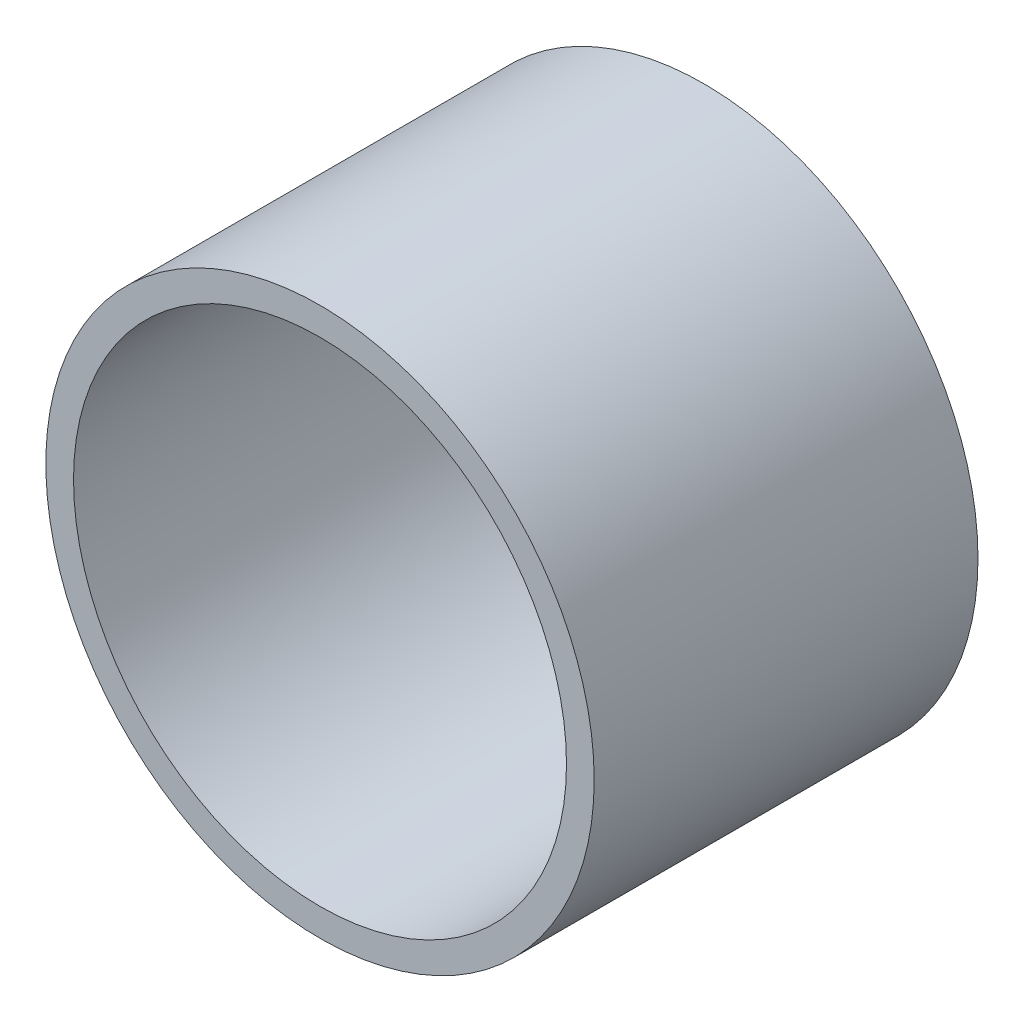
ISO-10303-21;
HEADER;
FILE_DESCRIPTION(('STEP AP214'),'2;1');
FILE_NAME('part.step','',(''),(''),'','','');
FILE_SCHEMA(('AUTOMOTIVE_DESIGN { 1 0 10303 214 1 1 1 1 }'));
ENDSEC;
DATA;
#1=APPLICATION_CONTEXT('core data for automotive mechanical design processes');
#2=APPLICATION_PROTOCOL_DEFINITION('international standard','automotive_design',2000,#1);
#3=PRODUCT_CONTEXT('',#1,'mechanical');
#4=PRODUCT('Part','Part','',(#3));
#5=PRODUCT_RELATED_PRODUCT_CATEGORY('part','',(#4));
#6=PRODUCT_DEFINITION_FORMATION('','',#4);
#7=PRODUCT_DEFINITION_CONTEXT('part definition',#1,'design');
#8=PRODUCT_DEFINITION('design','',#6,#7);
#9=PRODUCT_DEFINITION_SHAPE('','',#8);
#10=(LENGTH_UNIT() NAMED_UNIT(*) SI_UNIT(.MILLI.,.METRE.));
#11=(NAMED_UNIT(*) PLANE_ANGLE_UNIT() SI_UNIT($,.RADIAN.));
#12=(NAMED_UNIT(*) SI_UNIT($,.STERADIAN.) SOLID_ANGLE_UNIT());
#13=UNCERTAINTY_MEASURE_WITH_UNIT(LENGTH_MEASURE(1.E-05),#10,'distance_accuracy_value','');
#14=(GEOMETRIC_REPRESENTATION_CONTEXT(3) GLOBAL_UNCERTAINTY_ASSIGNED_CONTEXT((#13)) GLOBAL_UNIT_ASSIGNED_CONTEXT((#10,
#11,#12)) REPRESENTATION_CONTEXT('',''));
#15=CARTESIAN_POINT('',(0.,0.,0.));
#16=DIRECTION('',(0.,0.,1.));
#17=DIRECTION('',(1.,0.,0.));
#18=AXIS2_PLACEMENT_3D('',#15,#16,#17);
#19=CARTESIAN_POINT('',(0.,0.,35.2));
#20=DIRECTION('',(0.,0.,1.));
#21=DIRECTION('',(1.,0.,0.));
#22=AXIS2_PLACEMENT_3D('',#19,#20,#21);
#23=PLANE('',#22);
#24=CARTESIAN_POINT('',(0.,0.,35.2));
#25=DIRECTION('',(0.,0.,1.));
#26=DIRECTION('',(1.,0.,0.));
#27=AXIS2_PLACEMENT_3D('',#24,#25,#26);
#28=CIRCLE('',#27,25.146);
#29=CARTESIAN_POINT('',(25.146,0.,35.2));
#30=VERTEX_POINT('',#29);
#31=EDGE_CURVE('E10',#30,#30,#28,.T.);
#32=ORIENTED_EDGE('',*,*,#31,.T.);
#33=EDGE_LOOP('',(#32));
#34=FACE_BOUND('',#33,.T.);
#35=CARTESIAN_POINT('',(0.,0.,35.2));
#36=DIRECTION('',(0.,0.,1.));
#37=DIRECTION('',(1.,0.,0.));
#38=AXIS2_PLACEMENT_3D('',#35,#36,#37);
#39=CIRCLE('',#38,22.606);
#40=CARTESIAN_POINT('',(22.606,0.,35.2));
#41=VERTEX_POINT('',#40);
#42=EDGE_CURVE('E56',#41,#41,#39,.T.);
#43=ORIENTED_EDGE('',*,*,#42,.F.);
#44=EDGE_LOOP('',(#43));
#45=FACE_BOUND('',#44,.T.);
#46=ADVANCED_FACE('F43',(#34,#45),#23,.T.);
#47=CARTESIAN_POINT('',(0.,0.,0.));
#48=DIRECTION('',(0.,0.,1.));
#49=DIRECTION('',(1.,0.,0.));
#50=AXIS2_PLACEMENT_3D('',#47,#48,#49);
#51=PLANE('',#50);
#52=CARTESIAN_POINT('',(0.,0.,0.));
#53=DIRECTION('',(0.,0.,1.));
#54=DIRECTION('',(1.,0.,0.));
#55=AXIS2_PLACEMENT_3D('',#52,#53,#54);
#56=CIRCLE('',#55,25.146);
#57=CARTESIAN_POINT('',(25.146,0.,0.));
#58=VERTEX_POINT('',#57);
#59=EDGE_CURVE('E47',#58,#58,#56,.T.);
#60=ORIENTED_EDGE('',*,*,#59,.F.);
#61=EDGE_LOOP('',(#60));
#62=FACE_BOUND('',#61,.T.);
#63=CARTESIAN_POINT('',(0.,0.,0.));
#64=DIRECTION('',(0.,0.,1.));
#65=DIRECTION('',(1.,0.,0.));
#66=AXIS2_PLACEMENT_3D('',#63,#64,#65);
#67=CIRCLE('',#66,22.606);
#68=CARTESIAN_POINT('',(22.606,0.,0.));
#69=VERTEX_POINT('',#68);
#70=EDGE_CURVE('E58',#69,#69,#67,.T.);
#71=ORIENTED_EDGE('',*,*,#70,.T.);
#72=EDGE_LOOP('',(#71));
#73=FACE_BOUND('',#72,.T.);
#74=ADVANCED_FACE('F70',(#62,#73),#51,.F.);
#75=CARTESIAN_POINT('',(0.,0.,35.2));
#76=DIRECTION('',(0.,0.,-1.));
#77=DIRECTION('',(-1.,0.,0.));
#78=AXIS2_PLACEMENT_3D('',#75,#76,#77);
#79=CYLINDRICAL_SURFACE('',#78,25.146);
#80=ORIENTED_EDGE('',*,*,#31,.F.);
#81=EDGE_LOOP('',(#80));
#82=FACE_BOUND('',#81,.T.);
#83=ORIENTED_EDGE('',*,*,#59,.T.);
#84=EDGE_LOOP('',(#83));
#85=FACE_BOUND('',#84,.T.);
#86=ADVANCED_FACE('F45',(#82,#85),#79,.T.);
#87=CARTESIAN_POINT('',(0.,0.,35.2));
#88=DIRECTION('',(0.,0.,-1.));
#89=DIRECTION('',(-1.,0.,0.));
#90=AXIS2_PLACEMENT_3D('',#87,#88,#89);
#91=CYLINDRICAL_SURFACE('',#90,22.606);
#92=ORIENTED_EDGE('',*,*,#42,.T.);
#93=EDGE_LOOP('',(#92));
#94=FACE_BOUND('',#93,.T.);
#95=ORIENTED_EDGE('',*,*,#70,.F.);
#96=EDGE_LOOP('',(#95));
#97=FACE_BOUND('',#96,.T.);
#98=ADVANCED_FACE('F66',(#94,#97),#91,.F.);
#99=CLOSED_SHELL('',(#46,#74,#86,#98));
#100=MANIFOLD_SOLID_BREP('B2',#99);
#101=ADVANCED_BREP_SHAPE_REPRESENTATION('',(#18,#100),#14);
#102=SHAPE_DEFINITION_REPRESENTATION(#9,#101);
ENDSEC;
END-ISO-10303-21;
